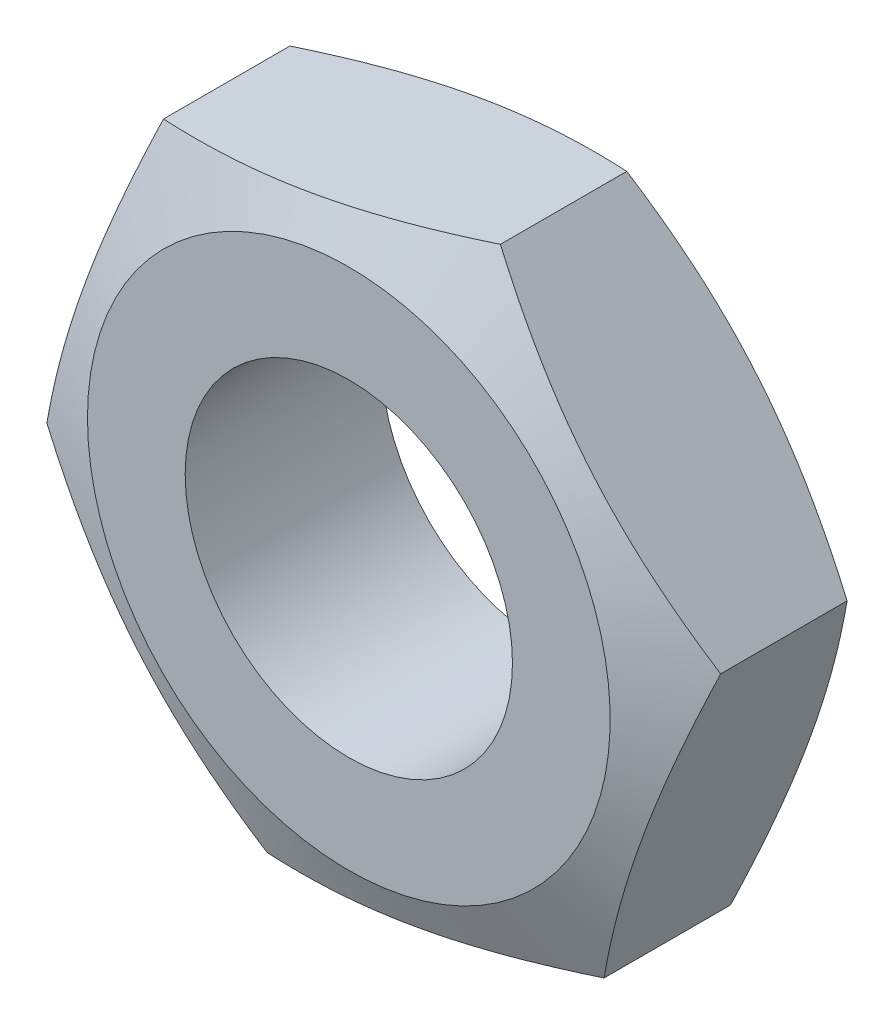
ISO-10303-21;
HEADER;
FILE_DESCRIPTION(('STEP AP214'),'2;1');
FILE_NAME('part.step','',(''),(''),'','','');
FILE_SCHEMA(('AUTOMOTIVE_DESIGN { 1 0 10303 214 1 1 1 1 }'));
ENDSEC;
DATA;
#1=APPLICATION_CONTEXT('core data for automotive mechanical design processes');
#2=APPLICATION_PROTOCOL_DEFINITION('international standard','automotive_design',2000,#1);
#3=PRODUCT_CONTEXT('',#1,'mechanical');
#4=PRODUCT('Part','Part','',(#3));
#5=PRODUCT_RELATED_PRODUCT_CATEGORY('part','',(#4));
#6=PRODUCT_DEFINITION_FORMATION('','',#4);
#7=PRODUCT_DEFINITION_CONTEXT('part definition',#1,'design');
#8=PRODUCT_DEFINITION('design','',#6,#7);
#9=PRODUCT_DEFINITION_SHAPE('','',#8);
#10=(LENGTH_UNIT() NAMED_UNIT(*) SI_UNIT(.MILLI.,.METRE.));
#11=(NAMED_UNIT(*) PLANE_ANGLE_UNIT() SI_UNIT($,.RADIAN.));
#12=(NAMED_UNIT(*) SI_UNIT($,.STERADIAN.) SOLID_ANGLE_UNIT());
#13=UNCERTAINTY_MEASURE_WITH_UNIT(LENGTH_MEASURE(1.E-05),#10,'distance_accuracy_value','');
#14=(GEOMETRIC_REPRESENTATION_CONTEXT(3) GLOBAL_UNCERTAINTY_ASSIGNED_CONTEXT((#13)) GLOBAL_UNIT_ASSIGNED_CONTEXT((#10,
#11,#12)) REPRESENTATION_CONTEXT('',''));
#15=CARTESIAN_POINT('',(0.,0.,0.));
#16=DIRECTION('',(0.,0.,1.));
#17=DIRECTION('',(1.,0.,0.));
#18=AXIS2_PLACEMENT_3D('',#15,#16,#17);
#19=CARTESIAN_POINT('',(0.,0.,0.));
#20=DIRECTION('',(0.,0.,1.));
#21=DIRECTION('',(1.,0.,0.));
#22=AXIS2_PLACEMENT_3D('',#19,#20,#21);
#23=PLANE('',#22);
#24=CARTESIAN_POINT('',(0.,0.,0.));
#25=DIRECTION('',(0.,0.,1.));
#26=DIRECTION('',(1.,0.,0.));
#27=AXIS2_PLACEMENT_3D('',#24,#25,#26);
#28=CIRCLE('',#27,1.25);
#29=CARTESIAN_POINT('',(1.25,0.,0.));
#30=VERTEX_POINT('',#29);
#31=EDGE_CURVE('E218',#30,#30,#28,.T.);
#32=ORIENTED_EDGE('',*,*,#31,.T.);
#33=EDGE_LOOP('',(#32));
#34=FACE_BOUND('',#33,.T.);
#35=CARTESIAN_POINT('',(0.,0.,0.));
#36=DIRECTION('',(0.,0.,-1.));
#37=DIRECTION('',(-1.,0.,0.));
#38=AXIS2_PLACEMENT_3D('',#35,#36,#37);
#39=CIRCLE('',#38,1.9964338621196);
#40=CARTESIAN_POINT('',(-1.9964338621196,0.,0.));
#41=VERTEX_POINT('',#40);
#42=EDGE_CURVE('E106',#41,#41,#39,.T.);
#43=ORIENTED_EDGE('',*,*,#42,.T.);
#44=EDGE_LOOP('',(#43));
#45=FACE_BOUND('',#44,.T.);
#46=ADVANCED_FACE('F34',(#34,#45),#23,.F.);
#47=CARTESIAN_POINT('',(0.,0.,1.5));
#48=DIRECTION('',(0.,0.,1.));
#49=DIRECTION('',(1.,0.,0.));
#50=AXIS2_PLACEMENT_3D('',#47,#48,#49);
#51=PLANE('',#50);
#52=CARTESIAN_POINT('',(0.,0.,1.5));
#53=DIRECTION('',(0.,0.,1.));
#54=DIRECTION('',(1.,0.,0.));
#55=AXIS2_PLACEMENT_3D('',#52,#53,#54);
#56=CIRCLE('',#55,1.25);
#57=CARTESIAN_POINT('',(1.25,0.,1.5));
#58=VERTEX_POINT('',#57);
#59=EDGE_CURVE('E113',#58,#58,#56,.T.);
#60=ORIENTED_EDGE('',*,*,#59,.F.);
#61=EDGE_LOOP('',(#60));
#62=FACE_BOUND('',#61,.T.);
#63=CARTESIAN_POINT('',(0.,0.,1.5));
#64=DIRECTION('',(0.,0.,-1.));
#65=DIRECTION('',(-1.,0.,0.));
#66=AXIS2_PLACEMENT_3D('',#63,#64,#65);
#67=CIRCLE('',#66,1.9964338621196);
#68=CARTESIAN_POINT('',(-1.9964338621196,0.,1.5));
#69=VERTEX_POINT('',#68);
#70=EDGE_CURVE('E205',#69,#69,#67,.T.);
#71=ORIENTED_EDGE('',*,*,#70,.F.);
#72=EDGE_LOOP('',(#71));
#73=FACE_BOUND('',#72,.T.);
#74=ADVANCED_FACE('F227',(#62,#73),#51,.T.);
#75=CARTESIAN_POINT('',(-2.5734860806943,-0.45740864433382,1.5));
#76=DIRECTION('',(0.765163726388851,0.643835749099666,0.));
#77=DIRECTION('',(-0.643835749099666,0.765163726388851,0.));
#78=AXIS2_PLACEMENT_3D('',#75,#76,#77);
#79=PLANE('',#78);
#80=DIRECTION('',(0.,0.,-1.));
#81=VECTOR('',#80,1.);
#82=CARTESIAN_POINT('',(-2.5734860806943,-0.45740864433382,1.5));
#83=LINE('',#82,#81);
#84=CARTESIAN_POINT('',(-2.5734860806943,-0.45740864433382,1.23281146953543));
#85=VERTEX_POINT('',#84);
#86=CARTESIAN_POINT('',(-2.5734860806943,-0.45740864433382,0.267188530464573));
#87=VERTEX_POINT('',#86);
#88=EDGE_CURVE('E109',#85,#87,#83,.T.);
#89=ORIENTED_EDGE('',*,*,#88,.T.);
#90=CARTESIAN_POINT('',(-2.57365436774892,-0.45720864433382,0.267245094366945));
#91=CARTESIAN_POINT('',(-2.51878290560832,-0.522420388948222,0.248800615932987));
#92=CARTESIAN_POINT('',(-2.46372040901567,-0.5878591676057,0.231643499402701));
#93=CARTESIAN_POINT('',(-2.35320820511875,-0.719196903765056,0.200370582365983));
#94=CARTESIAN_POINT('',(-2.29775829667242,-0.785096100313316,0.186256505165237));
#95=CARTESIAN_POINT('',(-2.18651089418584,-0.917307579959701,0.161554334055283));
#96=CARTESIAN_POINT('',(-2.13071329751172,-0.98361998503261,0.1509673369398));
#97=CARTESIAN_POINT('',(-2.01887341675494,-1.11653559283849,0.133758540285615));
#98=CARTESIAN_POINT('',(-1.96283118504486,-1.18313873332953,0.127135930299055));
#99=CARTESIAN_POINT('',(-1.85165508432355,-1.31526547471079,0.118243738336904));
#100=CARTESIAN_POINT('',(-1.79652387881437,-1.38078591017388,0.115894889587258));
#101=CARTESIAN_POINT('',(-1.68624963704821,-1.51184084129954,0.115420062847678));
#102=CARTESIAN_POINT('',(-1.63110660022143,-1.5773753376393,0.117294393090739));
#103=CARTESIAN_POINT('',(-1.52099131710902,-1.7082413550614,0.125172819150952));
#104=CARTESIAN_POINT('',(-1.4660189667097,-1.77357299987721,0.131173467894644));
#105=CARTESIAN_POINT('',(-1.35630586943253,-1.903961041336,0.147030414478095));
#106=CARTESIAN_POINT('',(-1.30156512775155,-1.96901743180281,0.156886798374337));
#107=CARTESIAN_POINT('',(-1.21714892390885,-2.06934149300972,0.174805250354596));
#108=CARTESIAN_POINT('',(-1.18736362721568,-2.10473969610921,0.181654197084402));
#109=CARTESIAN_POINT('',(-1.12789474701543,-2.17541522172554,0.196312206455974));
#110=CARTESIAN_POINT('',(-1.09821115087657,-2.21069255925454,0.204121145063068));
#111=CARTESIAN_POINT('',(-1.03878605757087,-2.2813160465312,0.220671079612786));
#112=CARTESIAN_POINT('',(-1.00904512108844,-2.31666152993596,0.229416905961687));
#113=CARTESIAN_POINT('',(-0.949667519181424,-2.38722857627152,0.247731940958818));
#114=CARTESIAN_POINT('',(-0.920030856706282,-2.42245013569707,0.257301172705654));
#115=CARTESIAN_POINT('',(-0.890447247388834,-2.45760864433382,0.267245094366945));
#116=B_SPLINE_CURVE_WITH_KNOTS('',3,(#90,#91,#92,#93,#94,#95,#96,#97,#98,#99,#100,#101,#102,
#103,#104,#105,#106,#107,#108,#109,#110,#111,#112,#113,#114,#115),.UNSPECIFIED.,.F.,.F.,(4,2,2,
2,2,2,2,2,2,2,2,2,4),(0.,0.261613286944468,0.523374341389504,0.785216718197723,1.04700554773064,
1.303887382666,1.5607879669895,1.8174742001716,2.07416616268251,2.21445703266343,
2.35472979553326,2.49576417008894,2.63680250230672),.UNSPECIFIED.);
#117=CARTESIAN_POINT('',(-0.890615534443459,-2.45740864433382,0.267188530464573));
#118=VERTEX_POINT('',#117);
#119=EDGE_CURVE('E56',#87,#118,#116,.T.);
#120=ORIENTED_EDGE('',*,*,#119,.T.);
#121=DIRECTION('',(0.,0.,-1.));
#122=VECTOR('',#121,1.);
#123=CARTESIAN_POINT('',(-0.890615534443459,-2.45740864433382,1.5));
#124=LINE('',#123,#122);
#125=CARTESIAN_POINT('',(-0.890615534443459,-2.45740864433382,1.23281146953543));
#126=VERTEX_POINT('',#125);
#127=EDGE_CURVE('E122',#126,#118,#124,.T.);
#128=ORIENTED_EDGE('',*,*,#127,.F.);
#129=CARTESIAN_POINT('',(-0.890447247388834,-2.45760864433382,1.23275490563305));
#130=CARTESIAN_POINT('',(-0.945318709529438,-2.39239689971942,1.25119938406701));
#131=CARTESIAN_POINT('',(-1.00038120612209,-2.32695812106194,1.2683565005973));
#132=CARTESIAN_POINT('',(-1.11089341001901,-2.19562038490258,1.29962941763402));
#133=CARTESIAN_POINT('',(-1.16634331846534,-2.12972118835432,1.31374349483476));
#134=CARTESIAN_POINT('',(-1.27759072095191,-1.99750970870794,1.33844566594472));
#135=CARTESIAN_POINT('',(-1.33338831762604,-1.93119730363503,1.3490326630602));
#136=CARTESIAN_POINT('',(-1.44522819838281,-1.79828169582915,1.36624145971438));
#137=CARTESIAN_POINT('',(-1.5012704300929,-1.73167855533811,1.37286406970095));
#138=CARTESIAN_POINT('',(-1.61244653081421,-1.59955181395686,1.3817562616631));
#139=CARTESIAN_POINT('',(-1.66757773632339,-1.53403137849376,1.38410511041274));
#140=CARTESIAN_POINT('',(-1.77785197808955,-1.4029764473681,1.38457993715232));
#141=CARTESIAN_POINT('',(-1.83299501491633,-1.33744195102834,1.38270560690926));
#142=CARTESIAN_POINT('',(-1.94311029802873,-1.20657593360624,1.37482718084905));
#143=CARTESIAN_POINT('',(-1.99808264842805,-1.14124428879043,1.36882653210536));
#144=CARTESIAN_POINT('',(-2.10779574570522,-1.01085624733164,1.35296958552191));
#145=CARTESIAN_POINT('',(-2.16253648738621,-0.945799856864835,1.34311320162566));
#146=CARTESIAN_POINT('',(-2.2469526912289,-0.845475795657918,1.3251947496454));
#147=CARTESIAN_POINT('',(-2.27673798792207,-0.810077592558427,1.3183458029156));
#148=CARTESIAN_POINT('',(-2.33620686812232,-0.739402066942102,1.30368779354403));
#149=CARTESIAN_POINT('',(-2.36589046426118,-0.704124729413098,1.29587885493693));
#150=CARTESIAN_POINT('',(-2.42531555756688,-0.633501242136442,1.27932892038721));
#151=CARTESIAN_POINT('',(-2.45505649404931,-0.598155758731684,1.27058309403831));
#152=CARTESIAN_POINT('',(-2.51443409595633,-0.527588712396124,1.25226805904118));
#153=CARTESIAN_POINT('',(-2.54407075843147,-0.492367152970572,1.24269882729435));
#154=CARTESIAN_POINT('',(-2.57365436774892,-0.45720864433382,1.23275490563306));
#155=B_SPLINE_CURVE_WITH_KNOTS('',3,(#129,#130,#131,#132,#133,#134,#135,#136,#137,#138,#139,
#140,#141,#142,#143,#144,#145,#146,#147,#148,#149,#150,#151,#152,#153,#154),.UNSPECIFIED.,.F.,
.F.,(4,2,2,2,2,2,2,2,2,2,2,2,4),(0.,0.261613286944469,0.523374341389504,0.785216718197723,
1.04700554773064,1.303887382666,1.5607879669895,1.8174742001716,2.07416616268251,
2.21445703266343,2.35472979553326,2.49576417008894,2.63680250230672),.UNSPECIFIED.);
#156=EDGE_CURVE('E173',#126,#85,#155,.T.);
#157=ORIENTED_EDGE('',*,*,#156,.T.);
#158=EDGE_LOOP('',(#89,#120,#128,#157));
#159=FACE_BOUND('',#158,.T.);
#160=ADVANCED_FACE('F36',(#159),#79,.F.);
#161=CARTESIAN_POINT('',(-0.890615534443459,-2.45740864433382,1.5));
#162=DIRECTION('',(-0.174996251390469,0.984569099656943,0.));
#163=DIRECTION('',(-0.984569099656943,-0.174996251390469,0.));
#164=AXIS2_PLACEMENT_3D('',#161,#162,#163);
#165=PLANE('',#164);
#166=ORIENTED_EDGE('',*,*,#127,.T.);
#167=CARTESIAN_POINT('',(-0.890815534443459,-2.45744419211842,0.267232488702841));
#168=CARTESIAN_POINT('',(-0.806906217433546,-2.44253024048355,0.248788941701403));
#169=CARTESIAN_POINT('',(-0.722704774577323,-2.42756436671538,0.231632762864086));
#170=CARTESIAN_POINT('',(-0.55370978660962,-2.39752737956188,0.200361707188726));
#171=CARTESIAN_POINT('',(-0.468915933941891,-2.38245621151184,0.186248553532844));
#172=CARTESIAN_POINT('',(-0.298796744684098,-2.35221941003181,0.161548189218004));
#173=CARTESIAN_POINT('',(-0.213471251259652,-2.33705374872625,0.15096207460409));
#174=CARTESIAN_POINT('',(-0.0424461210352604,-2.30665592627451,0.133754957650613));
#175=CARTESIAN_POINT('',(0.0432534356873319,-2.29142377936121,0.127133144920263));
#176=CARTESIAN_POINT('',(0.213263536061769,-2.26120636722181,0.118242400976821));
#177=CARTESIAN_POINT('',(0.297570007551607,-2.24622182577742,0.115894209553515));
#178=CARTESIAN_POINT('',(0.466201013570953,-2.21624953238342,0.115420547349463));
#179=CARTESIAN_POINT('',(0.550525548969739,-2.2012617802793,0.11729538480095));
#180=CARTESIAN_POINT('',(0.718913434853586,-2.17133269879634,0.125174654233086));
#181=CARTESIAN_POINT('',(0.802976944549924,-2.15639134111945,0.131175639610535));
#182=CARTESIAN_POINT('',(0.970749788241932,-2.12657157657326,0.147033086657646));
#183=CARTESIAN_POINT('',(1.05445911429318,-2.111693171116,0.156889634349916));
#184=CARTESIAN_POINT('',(1.18354229520619,-2.08875006556332,0.174807418652222));
#185=CARTESIAN_POINT('',(1.22908412645975,-2.08065550952494,0.181655459800297));
#186=CARTESIAN_POINT('',(1.32001228988117,-2.0644940356882,0.196311380934983));
#187=CARTESIAN_POINT('',(1.36539864136312,-2.05642711445698,0.204119136904277));
#188=CARTESIAN_POINT('',(1.45625985427899,-2.04027754033099,0.220666445815412));
#189=CARTESIAN_POINT('',(1.50173385870649,-2.03219503975962,0.229410826954153));
#190=CARTESIAN_POINT('',(1.59252246281335,-2.01605837104514,0.247722753965401));
#191=CARTESIAN_POINT('',(1.63783705797464,-2.00800420370507,0.257290322976655));
#192=CARTESIAN_POINT('',(1.68307054625084,-1.9999644522154,0.267232488702841));
#193=B_SPLINE_CURVE_WITH_KNOTS('',3,(#167,#168,#169,#170,#171,#172,#173,#174,#175,#176,#177,
#178,#179,#180,#181,#182,#183,#184,#185,#186,#187,#188,#189,#190,#191,#192),.UNSPECIFIED.,.F.,
.F.,(4,2,2,2,2,2,2,2,2,2,2,2,4),(0.,0.261608401495317,0.523364557876211,0.785201980589972,
1.04698585966345,1.30386309829466,1.56075908659882,1.81744074797904,2.07412813658756,
2.2143988395079,2.35465143523268,2.49566539561224,2.63668332100781),.UNSPECIFIED.);
#194=CARTESIAN_POINT('',(1.68287054625084,-2.,0.267188530464574));
#195=VERTEX_POINT('',#194);
#196=EDGE_CURVE('E187',#118,#195,#193,.T.);
#197=ORIENTED_EDGE('',*,*,#196,.T.);
#198=DIRECTION('',(0.,0.,-1.));
#199=VECTOR('',#198,1.);
#200=CARTESIAN_POINT('',(1.68287054625084,-2.,1.5));
#201=LINE('',#200,#199);
#202=CARTESIAN_POINT('',(1.68287054625084,-2.,1.23281146953543));
#203=VERTEX_POINT('',#202);
#204=EDGE_CURVE('E119',#203,#195,#201,.T.);
#205=ORIENTED_EDGE('',*,*,#204,.F.);
#206=CARTESIAN_POINT('',(1.68307054625084,-1.9999644522154,1.23276751129716));
#207=CARTESIAN_POINT('',(1.59916122924092,-2.01487840385027,1.2512110582986));
#208=CARTESIAN_POINT('',(1.5149597863847,-2.02984427761844,1.26836723713591));
#209=CARTESIAN_POINT('',(1.345964798417,-2.05988126477194,1.29963829281127));
#210=CARTESIAN_POINT('',(1.26117094574927,-2.07495243282198,1.31375144646716));
#211=CARTESIAN_POINT('',(1.09105175649148,-2.10518923430201,1.338451810782));
#212=CARTESIAN_POINT('',(1.00572626306703,-2.12035489560757,1.34903792539591));
#213=CARTESIAN_POINT('',(0.834701132842638,-2.15075271805931,1.36624504234939));
#214=CARTESIAN_POINT('',(0.749001576120046,-2.16598486497262,1.37286685507974));
#215=CARTESIAN_POINT('',(0.578991475745609,-2.19620227711201,1.38175759902318));
#216=CARTESIAN_POINT('',(0.494685004255771,-2.2111868185564,1.38410579044649));
#217=CARTESIAN_POINT('',(0.326053998236425,-2.24115911195041,1.38457945265054));
#218=CARTESIAN_POINT('',(0.241729462837639,-2.25614686405452,1.38270461519905));
#219=CARTESIAN_POINT('',(0.0733415769537918,-2.28607594553748,1.37482534576691));
#220=CARTESIAN_POINT('',(-0.0107219327425462,-2.30101730321437,1.36882436038947));
#221=CARTESIAN_POINT('',(-0.178494776434554,-2.33083706776056,1.35296691334235));
#222=CARTESIAN_POINT('',(-0.262204102485802,-2.34571547321782,1.34311036565008));
#223=CARTESIAN_POINT('',(-0.39128728339881,-2.3686585787705,1.32519258134778));
#224=CARTESIAN_POINT('',(-0.436829114652374,-2.37675313480888,1.3183445401997));
#225=CARTESIAN_POINT('',(-0.527757278073789,-2.39291460864562,1.30368861906502));
#226=CARTESIAN_POINT('',(-0.573143629555739,-2.40098152987685,1.29588086309572));
#227=CARTESIAN_POINT('',(-0.664004842471615,-2.41713110400284,1.27933355418459));
#228=CARTESIAN_POINT('',(-0.709478846899109,-2.4252136045742,1.27058917304585));
#229=CARTESIAN_POINT('',(-0.800267451005973,-2.44135027328868,1.2522772460346));
#230=CARTESIAN_POINT('',(-0.845582046167264,-2.44940444062875,1.24270967702334));
#231=CARTESIAN_POINT('',(-0.890815534443459,-2.45744419211842,1.23276751129716));
#232=B_SPLINE_CURVE_WITH_KNOTS('',3,(#206,#207,#208,#209,#210,#211,#212,#213,#214,#215,#216,
#217,#218,#219,#220,#221,#222,#223,#224,#225,#226,#227,#228,#229,#230,#231),.UNSPECIFIED.,.F.,
.F.,(4,2,2,2,2,2,2,2,2,2,2,2,4),(0.,0.261608401495317,0.523364557876211,0.785201980589972,
1.04698585966345,1.30386309829466,1.56075908659882,1.81744074797904,2.07412813658756,
2.2143988395079,2.35465143523268,2.49566539561224,2.63668332100781),.UNSPECIFIED.);
#233=EDGE_CURVE('E167',#203,#126,#232,.T.);
#234=ORIENTED_EDGE('',*,*,#233,.T.);
#235=EDGE_LOOP('',(#166,#197,#205,#234));
#236=FACE_BOUND('',#235,.T.);
#237=ADVANCED_FACE('F179',(#236),#165,.F.);
#238=CARTESIAN_POINT('',(1.68287054625084,-2.,1.5));
#239=DIRECTION('',(-0.94015997777932,0.340733350557277,0.));
#240=DIRECTION('',(-0.340733350557277,-0.94015997777932,0.));
#241=AXIS2_PLACEMENT_3D('',#238,#239,#240);
#242=PLANE('',#241);
#243=ORIENTED_EDGE('',*,*,#204,.T.);
#244=CARTESIAN_POINT('',(1.68279806212928,-2.0002,0.26723456522806));
#245=CARTESIAN_POINT('',(1.71183694182491,-1.92007519729217,0.24879086479191));
#246=CARTESIAN_POINT('',(1.74097691904915,-1.83967144375639,0.231634531488455));
#247=CARTESIAN_POINT('',(1.79946178613476,-1.67829853661446,0.200363169190784));
#248=CARTESIAN_POINT('',(1.82880678243523,-1.59732908931891,0.186249863399077));
#249=CARTESIAN_POINT('',(1.88768071056124,-1.4348826752294,0.161549201450022));
#250=CARTESIAN_POINT('',(1.91720969666962,-1.35340555865689,0.150962941461045));
#251=CARTESIAN_POINT('',(1.97639715221707,-1.19009405186927,0.133755547808921));
#252=CARTESIAN_POINT('',(2.0060555939428,-1.10825973812151,0.127133603745585));
#253=CARTESIAN_POINT('',(2.06489177228232,-0.945917484186481,0.118242621267531));
#254=CARTESIAN_POINT('',(2.09406809957546,-0.865413432631975,0.115894321561359));
#255=CARTESIAN_POINT('',(2.15242700694573,-0.704388076685079,0.115420467519875));
#256=CARTESIAN_POINT('',(2.18160958732382,-0.623866771462293,0.117295221416922));
#257=CARTESIAN_POINT('',(2.23988435933373,-0.463073563904768,0.125174351915881));
#258=CARTESIAN_POINT('',(2.26897660606447,-0.3828015095397,0.131175281837132));
#259=CARTESIAN_POINT('',(2.32703852878993,-0.222595601048158,0.147032646437355));
#260=CARTESIAN_POINT('',(2.35600820203514,-0.142661754508202,0.156889167144515));
#261=CARTESIAN_POINT('',(2.40068094239752,-0.0193996126669444,0.174807061435674));
#262=CARTESIAN_POINT('',(2.41644214086256,0.0240890801024344,0.181655251764694));
#263=CARTESIAN_POINT('',(2.44791072120718,0.110917973573387,0.196311516902094));
#264=CARTESIAN_POINT('',(2.463618109771,0.154258192718321,0.204119467690298));
#265=CARTESIAN_POINT('',(2.49506351977494,0.241023154006112,0.22066720912771));
#266=CARTESIAN_POINT('',(2.51080124460464,0.284447077734126,0.229411828337732));
#267=CARTESIAN_POINT('',(2.54222152569592,0.371142702697994,0.247724267330552));
#268=CARTESIAN_POINT('',(2.55790408039435,0.414414399620772,0.25729211024549));
#269=CARTESIAN_POINT('',(2.57355856481585,0.45760864433382,0.26723456522806));
#270=B_SPLINE_CURVE_WITH_KNOTS('',3,(#244,#245,#246,#247,#248,#249,#250,#251,#252,#253,#254,
#255,#256,#257,#258,#259,#260,#261,#262,#263,#264,#265,#266,#267,#268,#269),.UNSPECIFIED.,.F.,
.F.,(4,2,2,2,2,2,2,2,2,2,2,2,4),(0.,0.261609206257291,0.523366169478208,0.785204408261579,
1.04698910280587,1.30386709856878,1.56076384395773,1.81744625843359,2.07413440048378,
2.21440842561243,2.35466434355927,2.49568166685213,2.63670295394991),.UNSPECIFIED.);
#271=CARTESIAN_POINT('',(2.5734860806943,0.45740864433382,0.267188530464573));
#272=VERTEX_POINT('',#271);
#273=EDGE_CURVE('E195',#195,#272,#270,.T.);
#274=ORIENTED_EDGE('',*,*,#273,.T.);
#275=DIRECTION('',(0.,0.,-1.));
#276=VECTOR('',#275,1.);
#277=CARTESIAN_POINT('',(2.5734860806943,0.45740864433382,1.5));
#278=LINE('',#277,#276);
#279=CARTESIAN_POINT('',(2.5734860806943,0.45740864433382,1.23281146953543));
#280=VERTEX_POINT('',#279);
#281=EDGE_CURVE('E111',#280,#272,#278,.T.);
#282=ORIENTED_EDGE('',*,*,#281,.F.);
#283=CARTESIAN_POINT('',(2.57355856481585,0.45760864433382,1.23276543477194));
#284=CARTESIAN_POINT('',(2.54451968512022,0.377483841625987,1.25120913520809));
#285=CARTESIAN_POINT('',(2.51537970789599,0.297080088090213,1.26836546851155));
#286=CARTESIAN_POINT('',(2.45689484081037,0.135707180948281,1.29963683080922));
#287=CARTESIAN_POINT('',(2.4275498445099,0.0547377336527297,1.31375013660092));
#288=CARTESIAN_POINT('',(2.36867591638389,-0.107708680436776,1.33845079854998));
#289=CARTESIAN_POINT('',(2.33914693027551,-0.189185797009295,1.34903705853895));
#290=CARTESIAN_POINT('',(2.27995947472806,-0.352497303796915,1.36624445219108));
#291=CARTESIAN_POINT('',(2.25030103300234,-0.43433161754467,1.37286639625441));
#292=CARTESIAN_POINT('',(2.19146485466282,-0.5966738714797,1.38175737873247));
#293=CARTESIAN_POINT('',(2.16228852736967,-0.677177923034206,1.38410567843864));
#294=CARTESIAN_POINT('',(2.1039296199994,-0.838203278981102,1.38457953248012));
#295=CARTESIAN_POINT('',(2.07474703962131,-0.918724584203889,1.38270477858308));
#296=CARTESIAN_POINT('',(2.01647226761141,-1.07951779176141,1.37482564808412));
#297=CARTESIAN_POINT('',(1.98738002088066,-1.15978984612648,1.36882471816287));
#298=CARTESIAN_POINT('',(1.9293180981552,-1.31999575461802,1.35296735356265));
#299=CARTESIAN_POINT('',(1.90034842490999,-1.39992960115798,1.34311083285548));
#300=CARTESIAN_POINT('',(1.85567568454761,-1.52319174299924,1.32519293856433));
#301=CARTESIAN_POINT('',(1.83991448608257,-1.56668043576862,1.31834474823531));
#302=CARTESIAN_POINT('',(1.80844590573796,-1.65350932923957,1.30368848309791));
#303=CARTESIAN_POINT('',(1.79273851717413,-1.6968495483845,1.2958805323097));
#304=CARTESIAN_POINT('',(1.76129310717019,-1.78361450967229,1.27933279087229));
#305=CARTESIAN_POINT('',(1.74555538234049,-1.82703843340031,1.27058817166227));
#306=CARTESIAN_POINT('',(1.71413510124921,-1.91373405836417,1.25227573266945));
#307=CARTESIAN_POINT('',(1.69845254655078,-1.95700575528695,1.24270788975451));
#308=CARTESIAN_POINT('',(1.68279806212928,-2.0002,1.23276543477194));
#309=B_SPLINE_CURVE_WITH_KNOTS('',3,(#283,#284,#285,#286,#287,#288,#289,#290,#291,#292,#293,
#294,#295,#296,#297,#298,#299,#300,#301,#302,#303,#304,#305,#306,#307,#308),.UNSPECIFIED.,.F.,
.F.,(4,2,2,2,2,2,2,2,2,2,2,2,4),(0.,0.261609206257291,0.523366169478207,0.785204408261579,
1.04698910280587,1.30386709856878,1.56076384395773,1.81744625843359,2.07413440048378,
2.21440842561243,2.35466434355927,2.49568166685213,2.63670295394991),.UNSPECIFIED.);
#310=EDGE_CURVE('E160',#280,#203,#309,.T.);
#311=ORIENTED_EDGE('',*,*,#310,.T.);
#312=EDGE_LOOP('',(#243,#274,#282,#311));
#313=FACE_BOUND('',#312,.T.);
#314=ADVANCED_FACE('F182',(#313),#242,.F.);
#315=CARTESIAN_POINT('',(2.5734860806943,0.45740864433382,1.5));
#316=DIRECTION('',(-0.765163726388851,-0.643835749099666,0.));
#317=DIRECTION('',(0.643835749099666,-0.765163726388851,0.));
#318=AXIS2_PLACEMENT_3D('',#315,#316,#317);
#319=PLANE('',#318);
#320=ORIENTED_EDGE('',*,*,#281,.T.);
#321=CARTESIAN_POINT('',(2.57365436774892,0.45720864433382,0.267245094366945));
#322=CARTESIAN_POINT('',(2.51878290560832,0.522420388948222,0.248800615932987));
#323=CARTESIAN_POINT('',(2.46372040901567,0.587859167605701,0.231643499402701));
#324=CARTESIAN_POINT('',(2.35320820511875,0.719196903765057,0.200370582365983));
#325=CARTESIAN_POINT('',(2.29775829667242,0.785096100313316,0.186256505165237));
#326=CARTESIAN_POINT('',(2.18651089418584,0.917307579959701,0.161554334055283));
#327=CARTESIAN_POINT('',(2.13071329751172,0.98361998503261,0.1509673369398));
#328=CARTESIAN_POINT('',(2.01887341675494,1.11653559283849,0.133758540285615));
#329=CARTESIAN_POINT('',(1.96283118504486,1.18313873332953,0.127135930299055));
#330=CARTESIAN_POINT('',(1.85165508432355,1.31526547471079,0.118243738336904));
#331=CARTESIAN_POINT('',(1.79652387881437,1.38078591017388,0.115894889587258));
#332=CARTESIAN_POINT('',(1.68624963704821,1.51184084129954,0.115420062847678));
#333=CARTESIAN_POINT('',(1.63110660022143,1.5773753376393,0.117294393090739));
#334=CARTESIAN_POINT('',(1.52099131710902,1.7082413550614,0.125172819150952));
#335=CARTESIAN_POINT('',(1.4660189667097,1.77357299987721,0.131173467894643));
#336=CARTESIAN_POINT('',(1.35630586943253,1.903961041336,0.147030414478095));
#337=CARTESIAN_POINT('',(1.30156512775155,1.96901743180281,0.156886798374337));
#338=CARTESIAN_POINT('',(1.21714892390885,2.06934149300972,0.174805250354596));
#339=CARTESIAN_POINT('',(1.18736362721568,2.10473969610921,0.181654197084402));
#340=CARTESIAN_POINT('',(1.12789474701543,2.17541522172554,0.196312206455973));
#341=CARTESIAN_POINT('',(1.09821115087657,2.21069255925454,0.204121145063068));
#342=CARTESIAN_POINT('',(1.03878605757087,2.2813160465312,0.220671079612786));
#343=CARTESIAN_POINT('',(1.00904512108844,2.31666152993596,0.229416905961687));
#344=CARTESIAN_POINT('',(0.949667519181424,2.38722857627152,0.247731940958818));
#345=CARTESIAN_POINT('',(0.920030856706281,2.42245013569707,0.257301172705654));
#346=CARTESIAN_POINT('',(0.890447247388833,2.45760864433382,0.267245094366945));
#347=B_SPLINE_CURVE_WITH_KNOTS('',3,(#321,#322,#323,#324,#325,#326,#327,#328,#329,#330,#331,
#332,#333,#334,#335,#336,#337,#338,#339,#340,#341,#342,#343,#344,#345,#346),.UNSPECIFIED.,.F.,
.F.,(4,2,2,2,2,2,2,2,2,2,2,2,4),(0.,0.261613286944468,0.523374341389504,0.785216718197723,
1.04700554773064,1.303887382666,1.5607879669895,1.8174742001716,2.07416616268251,
2.21445703266343,2.35472979553326,2.49576417008894,2.63680250230672),.UNSPECIFIED.);
#348=CARTESIAN_POINT('',(0.890615534443458,2.45740864433382,0.267188530464574));
#349=VERTEX_POINT('',#348);
#350=EDGE_CURVE('E105',#272,#349,#347,.T.);
#351=ORIENTED_EDGE('',*,*,#350,.T.);
#352=DIRECTION('',(0.,0.,-1.));
#353=VECTOR('',#352,1.);
#354=CARTESIAN_POINT('',(0.890615534443458,2.45740864433382,1.5));
#355=LINE('',#354,#353);
#356=CARTESIAN_POINT('',(0.890615534443458,2.45740864433382,1.23281146953543));
#357=VERTEX_POINT('',#356);
#358=EDGE_CURVE('E104',#357,#349,#355,.T.);
#359=ORIENTED_EDGE('',*,*,#358,.F.);
#360=CARTESIAN_POINT('',(0.890447247388833,2.45760864433382,1.23275490563305));
#361=CARTESIAN_POINT('',(0.945318709529438,2.39239689971942,1.25119938406701));
#362=CARTESIAN_POINT('',(1.00038120612209,2.32695812106194,1.2683565005973));
#363=CARTESIAN_POINT('',(1.11089341001901,2.19562038490258,1.29962941763402));
#364=CARTESIAN_POINT('',(1.16634331846534,2.12972118835433,1.31374349483476));
#365=CARTESIAN_POINT('',(1.27759072095191,1.99750970870794,1.33844566594472));
#366=CARTESIAN_POINT('',(1.33338831762604,1.93119730363503,1.3490326630602));
#367=CARTESIAN_POINT('',(1.44522819838281,1.79828169582915,1.36624145971439));
#368=CARTESIAN_POINT('',(1.5012704300929,1.73167855533811,1.37286406970095));
#369=CARTESIAN_POINT('',(1.61244653081421,1.59955181395686,1.3817562616631));
#370=CARTESIAN_POINT('',(1.66757773632339,1.53403137849377,1.38410511041274));
#371=CARTESIAN_POINT('',(1.77785197808955,1.4029764473681,1.38457993715232));
#372=CARTESIAN_POINT('',(1.83299501491633,1.33744195102834,1.38270560690926));
#373=CARTESIAN_POINT('',(1.94311029802873,1.20657593360624,1.37482718084905));
#374=CARTESIAN_POINT('',(1.99808264842805,1.14124428879043,1.36882653210536));
#375=CARTESIAN_POINT('',(2.10779574570522,1.01085624733164,1.35296958552191));
#376=CARTESIAN_POINT('',(2.16253648738621,0.945799856864836,1.34311320162566));
#377=CARTESIAN_POINT('',(2.2469526912289,0.845475795657919,1.3251947496454));
#378=CARTESIAN_POINT('',(2.27673798792207,0.810077592558427,1.3183458029156));
#379=CARTESIAN_POINT('',(2.33620686812232,0.739402066942103,1.30368779354403));
#380=CARTESIAN_POINT('',(2.36589046426118,0.704124729413098,1.29587885493693));
#381=CARTESIAN_POINT('',(2.42531555756688,0.633501242136443,1.27932892038721));
#382=CARTESIAN_POINT('',(2.45505649404931,0.598155758731685,1.27058309403831));
#383=CARTESIAN_POINT('',(2.51443409595633,0.527588712396125,1.25226805904118));
#384=CARTESIAN_POINT('',(2.54407075843147,0.492367152970572,1.24269882729435));
#385=CARTESIAN_POINT('',(2.57365436774892,0.45720864433382,1.23275490563306));
#386=B_SPLINE_CURVE_WITH_KNOTS('',3,(#360,#361,#362,#363,#364,#365,#366,#367,#368,#369,#370,
#371,#372,#373,#374,#375,#376,#377,#378,#379,#380,#381,#382,#383,#384,#385),.UNSPECIFIED.,.F.,
.F.,(4,2,2,2,2,2,2,2,2,2,2,2,4),(0.,0.261613286944468,0.523374341389504,0.785216718197724,
1.04700554773064,1.303887382666,1.5607879669895,1.8174742001716,2.07416616268251,
2.21445703266343,2.35472979553326,2.49576417008894,2.63680250230672),.UNSPECIFIED.);
#387=EDGE_CURVE('E153',#357,#280,#386,.T.);
#388=ORIENTED_EDGE('',*,*,#387,.T.);
#389=EDGE_LOOP('',(#320,#351,#359,#388));
#390=FACE_BOUND('',#389,.T.);
#391=ADVANCED_FACE('F251',(#390),#319,.F.);
#392=CARTESIAN_POINT('',(0.890615534443458,2.45740864433382,1.5));
#393=DIRECTION('',(0.174996251390469,-0.984569099656943,0.));
#394=DIRECTION('',(0.984569099656943,0.174996251390469,0.));
#395=AXIS2_PLACEMENT_3D('',#392,#393,#394);
#396=PLANE('',#395);
#397=ORIENTED_EDGE('',*,*,#358,.T.);
#398=CARTESIAN_POINT('',(0.890815534443458,2.45744419211842,0.267232488702841));
#399=CARTESIAN_POINT('',(0.806906217433546,2.44253024048355,0.248788941701403));
#400=CARTESIAN_POINT('',(0.722704774577322,2.42756436671538,0.231632762864086));
#401=CARTESIAN_POINT('',(0.553709786609619,2.39752737956188,0.200361707188726));
#402=CARTESIAN_POINT('',(0.468915933941891,2.38245621151184,0.186248553532844));
#403=CARTESIAN_POINT('',(0.298796744684098,2.35221941003181,0.161548189218004));
#404=CARTESIAN_POINT('',(0.213471251259652,2.33705374872625,0.15096207460409));
#405=CARTESIAN_POINT('',(0.0424461210352602,2.30665592627452,0.133754957650614));
#406=CARTESIAN_POINT('',(-0.043253435687332,2.29142377936121,0.127133144920263));
#407=CARTESIAN_POINT('',(-0.213263536061769,2.26120636722181,0.118242400976821));
#408=CARTESIAN_POINT('',(-0.297570007551607,2.24622182577742,0.115894209553515));
#409=CARTESIAN_POINT('',(-0.466201013570953,2.21624953238342,0.115420547349463));
#410=CARTESIAN_POINT('',(-0.550525548969739,2.2012617802793,0.11729538480095));
#411=CARTESIAN_POINT('',(-0.718913434853586,2.17133269879634,0.125174654233086));
#412=CARTESIAN_POINT('',(-0.802976944549924,2.15639134111945,0.131175639610535));
#413=CARTESIAN_POINT('',(-0.970749788241932,2.12657157657326,0.147033086657646));
#414=CARTESIAN_POINT('',(-1.05445911429318,2.111693171116,0.156889634349916));
#415=CARTESIAN_POINT('',(-1.18354229520619,2.08875006556332,0.174807418652222));
#416=CARTESIAN_POINT('',(-1.22908412645975,2.08065550952494,0.181655459800297));
#417=CARTESIAN_POINT('',(-1.32001228988117,2.0644940356882,0.196311380934983));
#418=CARTESIAN_POINT('',(-1.36539864136312,2.05642711445698,0.204119136904277));
#419=CARTESIAN_POINT('',(-1.45625985427899,2.04027754033098,0.220666445815412));
#420=CARTESIAN_POINT('',(-1.50173385870649,2.03219503975962,0.229410826954153));
#421=CARTESIAN_POINT('',(-1.59252246281335,2.01605837104514,0.247722753965401));
#422=CARTESIAN_POINT('',(-1.63783705797464,2.00800420370507,0.257290322976655));
#423=CARTESIAN_POINT('',(-1.68307054625084,1.9999644522154,0.267232488702841));
#424=B_SPLINE_CURVE_WITH_KNOTS('',3,(#398,#399,#400,#401,#402,#403,#404,#405,#406,#407,#408,
#409,#410,#411,#412,#413,#414,#415,#416,#417,#418,#419,#420,#421,#422,#423),.UNSPECIFIED.,.F.,
.F.,(4,2,2,2,2,2,2,2,2,2,2,2,4),(0.,0.261608401495317,0.523364557876211,0.785201980589971,
1.04698585966345,1.30386309829466,1.56075908659882,1.81744074797904,2.07412813658756,
2.2143988395079,2.35465143523268,2.49566539561224,2.63668332100781),.UNSPECIFIED.);
#425=CARTESIAN_POINT('',(-1.68287054625084,2.,0.267188530464574));
#426=VERTEX_POINT('',#425);
#427=EDGE_CURVE('E92',#349,#426,#424,.T.);
#428=ORIENTED_EDGE('',*,*,#427,.T.);
#429=DIRECTION('',(0.,0.,-1.));
#430=VECTOR('',#429,1.);
#431=CARTESIAN_POINT('',(-1.68287054625084,2.,1.5));
#432=LINE('',#431,#430);
#433=CARTESIAN_POINT('',(-1.68287054625084,2.,1.23281146953543));
#434=VERTEX_POINT('',#433);
#435=EDGE_CURVE('E102',#434,#426,#432,.T.);
#436=ORIENTED_EDGE('',*,*,#435,.F.);
#437=CARTESIAN_POINT('',(-1.68307054625084,1.9999644522154,1.23276751129716));
#438=CARTESIAN_POINT('',(-1.59916122924092,2.01487840385027,1.2512110582986));
#439=CARTESIAN_POINT('',(-1.5149597863847,2.02984427761844,1.26836723713591));
#440=CARTESIAN_POINT('',(-1.345964798417,2.05988126477194,1.29963829281127));
#441=CARTESIAN_POINT('',(-1.26117094574927,2.07495243282198,1.31375144646716));
#442=CARTESIAN_POINT('',(-1.09105175649148,2.10518923430201,1.338451810782));
#443=CARTESIAN_POINT('',(-1.00572626306703,2.12035489560757,1.34903792539591));
#444=CARTESIAN_POINT('',(-0.834701132842638,2.15075271805931,1.36624504234939));
#445=CARTESIAN_POINT('',(-0.749001576120046,2.16598486497262,1.37286685507974));
#446=CARTESIAN_POINT('',(-0.578991475745609,2.19620227711201,1.38175759902318));
#447=CARTESIAN_POINT('',(-0.49468500425577,2.2111868185564,1.38410579044649));
#448=CARTESIAN_POINT('',(-0.326053998236425,2.24115911195041,1.38457945265054));
#449=CARTESIAN_POINT('',(-0.241729462837639,2.25614686405452,1.38270461519905));
#450=CARTESIAN_POINT('',(-0.0733415769537914,2.28607594553748,1.37482534576691));
#451=CARTESIAN_POINT('',(0.0107219327425468,2.30101730321437,1.36882436038947));
#452=CARTESIAN_POINT('',(0.178494776434555,2.33083706776056,1.35296691334235));
#453=CARTESIAN_POINT('',(0.262204102485802,2.34571547321782,1.34311036565008));
#454=CARTESIAN_POINT('',(0.391287283398811,2.3686585787705,1.32519258134778));
#455=CARTESIAN_POINT('',(0.436829114652375,2.37675313480888,1.3183445401997));
#456=CARTESIAN_POINT('',(0.527757278073789,2.39291460864562,1.30368861906502));
#457=CARTESIAN_POINT('',(0.57314362955574,2.40098152987685,1.29588086309572));
#458=CARTESIAN_POINT('',(0.664004842471615,2.41713110400284,1.27933355418459));
#459=CARTESIAN_POINT('',(0.709478846899109,2.4252136045742,1.27058917304585));
#460=CARTESIAN_POINT('',(0.800267451005973,2.44135027328868,1.2522772460346));
#461=CARTESIAN_POINT('',(0.845582046167264,2.44940444062875,1.24270967702334));
#462=CARTESIAN_POINT('',(0.890815534443458,2.45744419211842,1.23276751129716));
#463=B_SPLINE_CURVE_WITH_KNOTS('',3,(#437,#438,#439,#440,#441,#442,#443,#444,#445,#446,#447,
#448,#449,#450,#451,#452,#453,#454,#455,#456,#457,#458,#459,#460,#461,#462),.UNSPECIFIED.,.F.,
.F.,(4,2,2,2,2,2,2,2,2,2,2,2,4),(0.,0.261608401495317,0.523364557876211,0.785201980589972,
1.04698585966345,1.30386309829466,1.56075908659882,1.81744074797904,2.07412813658756,
2.2143988395079,2.35465143523269,2.49566539561224,2.63668332100781),.UNSPECIFIED.);
#464=EDGE_CURVE('E63',#434,#357,#463,.T.);
#465=ORIENTED_EDGE('',*,*,#464,.T.);
#466=EDGE_LOOP('',(#397,#428,#436,#465));
#467=FACE_BOUND('',#466,.T.);
#468=ADVANCED_FACE('F101',(#467),#396,.F.);
#469=CARTESIAN_POINT('',(-1.68287054625084,2.,1.5));
#470=DIRECTION('',(0.94015997777932,-0.340733350557277,0.));
#471=DIRECTION('',(0.340733350557277,0.94015997777932,0.));
#472=AXIS2_PLACEMENT_3D('',#469,#470,#471);
#473=PLANE('',#472);
#474=ORIENTED_EDGE('',*,*,#435,.T.);
#475=CARTESIAN_POINT('',(-1.68279806212928,2.0002,0.26723456522806));
#476=CARTESIAN_POINT('',(-1.71183694182491,1.92007519729217,0.24879086479191));
#477=CARTESIAN_POINT('',(-1.74097691904915,1.83967144375639,0.231634531488455));
#478=CARTESIAN_POINT('',(-1.79946178613476,1.67829853661446,0.200363169190784));
#479=CARTESIAN_POINT('',(-1.82880678243523,1.59732908931891,0.186249863399077));
#480=CARTESIAN_POINT('',(-1.88768071056124,1.4348826752294,0.161549201450022));
#481=CARTESIAN_POINT('',(-1.91720969666962,1.35340555865689,0.150962941461045));
#482=CARTESIAN_POINT('',(-1.97639715221707,1.19009405186927,0.133755547808921));
#483=CARTESIAN_POINT('',(-2.0060555939428,1.10825973812151,0.127133603745585));
#484=CARTESIAN_POINT('',(-2.06489177228232,0.945917484186481,0.118242621267531));
#485=CARTESIAN_POINT('',(-2.09406809957546,0.865413432631974,0.115894321561359));
#486=CARTESIAN_POINT('',(-2.15242700694574,0.704388076685079,0.115420467519876));
#487=CARTESIAN_POINT('',(-2.18160958732382,0.623866771462292,0.117295221416922));
#488=CARTESIAN_POINT('',(-2.23988435933373,0.463073563904767,0.125174351915881));
#489=CARTESIAN_POINT('',(-2.26897660606447,0.382801509539699,0.131175281837132));
#490=CARTESIAN_POINT('',(-2.32703852878993,0.222595601048157,0.147032646437355));
#491=CARTESIAN_POINT('',(-2.35600820203514,0.142661754508202,0.156889167144516));
#492=CARTESIAN_POINT('',(-2.40068094239752,0.0193996126669439,0.174807061435674));
#493=CARTESIAN_POINT('',(-2.41644214086256,-0.0240890801024349,0.181655251764694));
#494=CARTESIAN_POINT('',(-2.44791072120718,-0.110917973573387,0.196311516902094));
#495=CARTESIAN_POINT('',(-2.463618109771,-0.154258192718322,0.204119467690298));
#496=CARTESIAN_POINT('',(-2.49506351977494,-0.241023154006112,0.220667209127711));
#497=CARTESIAN_POINT('',(-2.51080124460464,-0.284447077734126,0.229411828337732));
#498=CARTESIAN_POINT('',(-2.54222152569592,-0.371142702697994,0.247724267330552));
#499=CARTESIAN_POINT('',(-2.55790408039435,-0.414414399620772,0.25729211024549));
#500=CARTESIAN_POINT('',(-2.57355856481585,-0.45760864433382,0.267234565228059));
#501=B_SPLINE_CURVE_WITH_KNOTS('',3,(#475,#476,#477,#478,#479,#480,#481,#482,#483,#484,#485,
#486,#487,#488,#489,#490,#491,#492,#493,#494,#495,#496,#497,#498,#499,#500),.UNSPECIFIED.,.F.,
.F.,(4,2,2,2,2,2,2,2,2,2,2,2,4),(0.,0.261609206257291,0.523366169478208,0.78520440826158,
1.04698910280587,1.30386709856878,1.56076384395773,1.81744625843359,2.07413440048378,
2.21440842561243,2.35466434355927,2.49568166685213,2.63670295394991),.UNSPECIFIED.);
#502=EDGE_CURVE('E11',#426,#87,#501,.T.);
#503=ORIENTED_EDGE('',*,*,#502,.T.);
#504=ORIENTED_EDGE('',*,*,#88,.F.);
#505=CARTESIAN_POINT('',(-2.57355856481585,-0.45760864433382,1.23276543477194));
#506=CARTESIAN_POINT('',(-2.54451968512022,-0.377483841625986,1.25120913520809));
#507=CARTESIAN_POINT('',(-2.51537970789599,-0.297080088090213,1.26836546851155));
#508=CARTESIAN_POINT('',(-2.45689484081037,-0.13570718094828,1.29963683080922));
#509=CARTESIAN_POINT('',(-2.4275498445099,-0.0547377336527293,1.31375013660092));
#510=CARTESIAN_POINT('',(-2.36867591638389,0.107708680436777,1.33845079854998));
#511=CARTESIAN_POINT('',(-2.33914693027551,0.189185797009295,1.34903705853895));
#512=CARTESIAN_POINT('',(-2.27995947472806,0.352497303796915,1.36624445219108));
#513=CARTESIAN_POINT('',(-2.25030103300234,0.43433161754467,1.37286639625441));
#514=CARTESIAN_POINT('',(-2.19146485466282,0.5966738714797,1.38175737873247));
#515=CARTESIAN_POINT('',(-2.16228852736967,0.677177923034206,1.38410567843864));
#516=CARTESIAN_POINT('',(-2.1039296199994,0.838203278981102,1.38457953248012));
#517=CARTESIAN_POINT('',(-2.07474703962131,0.918724584203889,1.38270477858308));
#518=CARTESIAN_POINT('',(-2.01647226761141,1.07951779176141,1.37482564808412));
#519=CARTESIAN_POINT('',(-1.98738002088066,1.15978984612648,1.36882471816287));
#520=CARTESIAN_POINT('',(-1.9293180981552,1.31999575461802,1.35296735356265));
#521=CARTESIAN_POINT('',(-1.90034842490999,1.39992960115798,1.34311083285548));
#522=CARTESIAN_POINT('',(-1.85567568454761,1.52319174299924,1.32519293856433));
#523=CARTESIAN_POINT('',(-1.83991448608257,1.56668043576862,1.31834474823531));
#524=CARTESIAN_POINT('',(-1.80844590573796,1.65350932923957,1.30368848309791));
#525=CARTESIAN_POINT('',(-1.79273851717413,1.6968495483845,1.2958805323097));
#526=CARTESIAN_POINT('',(-1.76129310717019,1.78361450967229,1.27933279087229));
#527=CARTESIAN_POINT('',(-1.74555538234049,1.82703843340031,1.27058817166227));
#528=CARTESIAN_POINT('',(-1.71413510124921,1.91373405836418,1.25227573266945));
#529=CARTESIAN_POINT('',(-1.69845254655078,1.95700575528695,1.24270788975451));
#530=CARTESIAN_POINT('',(-1.68279806212928,2.0002,1.23276543477194));
#531=B_SPLINE_CURVE_WITH_KNOTS('',3,(#505,#506,#507,#508,#509,#510,#511,#512,#513,#514,#515,
#516,#517,#518,#519,#520,#521,#522,#523,#524,#525,#526,#527,#528,#529,#530),.UNSPECIFIED.,.F.,
.F.,(4,2,2,2,2,2,2,2,2,2,2,2,4),(0.,0.261609206257291,0.523366169478207,0.785204408261579,
1.04698910280587,1.30386709856878,1.56076384395773,1.81744625843359,2.07413440048377,
2.21440842561243,2.35466434355927,2.49568166685213,2.63670295394991),.UNSPECIFIED.);
#532=EDGE_CURVE('E49',#85,#434,#531,.T.);
#533=ORIENTED_EDGE('',*,*,#532,.T.);
#534=EDGE_LOOP('',(#474,#503,#504,#533));
#535=FACE_BOUND('',#534,.T.);
#536=ADVANCED_FACE('F108',(#535),#473,.F.);
#537=CARTESIAN_POINT('',(0.,0.,1.5));
#538=DIRECTION('',(0.,0.,-1.));
#539=DIRECTION('',(-1.,0.,0.));
#540=AXIS2_PLACEMENT_3D('',#537,#538,#539);
#541=CYLINDRICAL_SURFACE('',#540,1.25);
#542=ORIENTED_EDGE('',*,*,#59,.T.);
#543=EDGE_LOOP('',(#542));
#544=FACE_BOUND('',#543,.T.);
#545=ORIENTED_EDGE('',*,*,#31,.F.);
#546=EDGE_LOOP('',(#545));
#547=FACE_BOUND('',#546,.T.);
#548=ADVANCED_FACE('F136',(#544,#547),#541,.F.);
#549=CARTESIAN_POINT('',(0.,0.,1.5));
#550=DIRECTION('',(0.,0.,-1.));
#551=DIRECTION('',(-1.,0.,0.));
#552=AXIS2_PLACEMENT_3D('',#549,#550,#551);
#553=CONICAL_SURFACE('',#552,1.9964338621196,1.1623594956241);
#554=ORIENTED_EDGE('',*,*,#70,.T.);
#555=EDGE_LOOP('',(#554));
#556=FACE_BOUND('',#555,.T.);
#557=ORIENTED_EDGE('',*,*,#233,.F.);
#558=ORIENTED_EDGE('',*,*,#310,.F.);
#559=ORIENTED_EDGE('',*,*,#387,.F.);
#560=ORIENTED_EDGE('',*,*,#464,.F.);
#561=ORIENTED_EDGE('',*,*,#532,.F.);
#562=ORIENTED_EDGE('',*,*,#156,.F.);
#563=EDGE_LOOP('',(#557,#558,#559,#560,#561,#562));
#564=FACE_BOUND('',#563,.T.);
#565=ADVANCED_FACE('F132',(#556,#564),#553,.T.);
#566=CARTESIAN_POINT('',(0.,0.,0.));
#567=DIRECTION('',(0.,0.,1.));
#568=DIRECTION('',(-1.,0.,0.));
#569=AXIS2_PLACEMENT_3D('',#566,#567,#568);
#570=CONICAL_SURFACE('',#569,1.9964338621196,1.1623594956241);
#571=ORIENTED_EDGE('',*,*,#42,.F.);
#572=EDGE_LOOP('',(#571));
#573=FACE_BOUND('',#572,.T.);
#574=ORIENTED_EDGE('',*,*,#502,.F.);
#575=ORIENTED_EDGE('',*,*,#427,.F.);
#576=ORIENTED_EDGE('',*,*,#350,.F.);
#577=ORIENTED_EDGE('',*,*,#273,.F.);
#578=ORIENTED_EDGE('',*,*,#196,.F.);
#579=ORIENTED_EDGE('',*,*,#119,.F.);
#580=EDGE_LOOP('',(#574,#575,#576,#577,#578,#579));
#581=FACE_BOUND('',#580,.T.);
#582=ADVANCED_FACE('F91',(#573,#581),#570,.T.);
#583=CLOSED_SHELL('',(#46,#74,#160,#237,#314,#391,#468,#536,#548,#565,#582));
#584=MANIFOLD_SOLID_BREP('B2',#583);
#585=ADVANCED_BREP_SHAPE_REPRESENTATION('',(#18,#584),#14);
#586=SHAPE_DEFINITION_REPRESENTATION(#9,#585);
ENDSEC;
END-ISO-10303-21;
